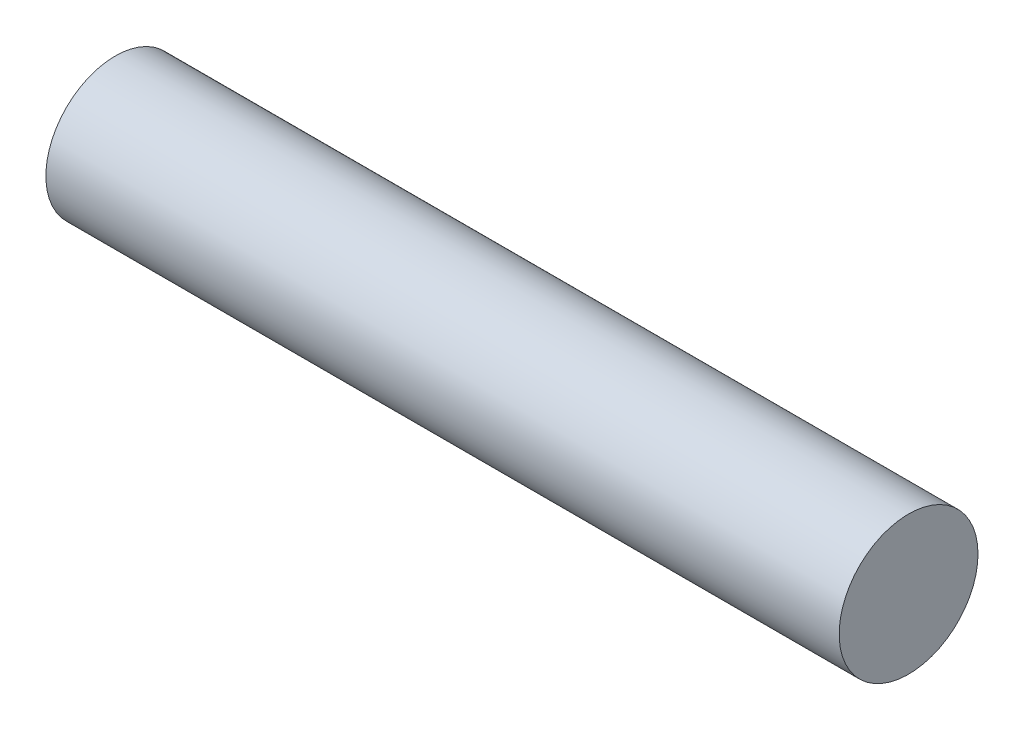
ISO-10303-21;
HEADER;
FILE_DESCRIPTION(('STEP AP214'),'2;1');
FILE_NAME('part.step','',(''),(''),'','','');
FILE_SCHEMA(('AUTOMOTIVE_DESIGN { 1 0 10303 214 1 1 1 1 }'));
ENDSEC;
DATA;
#1=APPLICATION_CONTEXT('core data for automotive mechanical design processes');
#2=APPLICATION_PROTOCOL_DEFINITION('international standard','automotive_design',2000,#1);
#3=PRODUCT_CONTEXT('',#1,'mechanical');
#4=PRODUCT('Part','Part','',(#3));
#5=PRODUCT_RELATED_PRODUCT_CATEGORY('part','',(#4));
#6=PRODUCT_DEFINITION_FORMATION('','',#4);
#7=PRODUCT_DEFINITION_CONTEXT('part definition',#1,'design');
#8=PRODUCT_DEFINITION('design','',#6,#7);
#9=PRODUCT_DEFINITION_SHAPE('','',#8);
#10=(LENGTH_UNIT() NAMED_UNIT(*) SI_UNIT(.MILLI.,.METRE.));
#11=(NAMED_UNIT(*) PLANE_ANGLE_UNIT() SI_UNIT($,.RADIAN.));
#12=(NAMED_UNIT(*) SI_UNIT($,.STERADIAN.) SOLID_ANGLE_UNIT());
#13=UNCERTAINTY_MEASURE_WITH_UNIT(LENGTH_MEASURE(1.E-05),#10,'distance_accuracy_value','');
#14=(GEOMETRIC_REPRESENTATION_CONTEXT(3) GLOBAL_UNCERTAINTY_ASSIGNED_CONTEXT((#13)) GLOBAL_UNIT_ASSIGNED_CONTEXT((#10,
#11,#12)) REPRESENTATION_CONTEXT('',''));
#15=CARTESIAN_POINT('',(0.,0.,0.));
#16=DIRECTION('',(0.,0.,1.));
#17=DIRECTION('',(1.,0.,0.));
#18=AXIS2_PLACEMENT_3D('',#15,#16,#17);
#19=CARTESIAN_POINT('',(20.,0.,0.));
#20=DIRECTION('',(-1.,0.,0.));
#21=DIRECTION('',(0.,0.,1.));
#22=AXIS2_PLACEMENT_3D('',#19,#20,#21);
#23=CYLINDRICAL_SURFACE('',#22,1.75);
#24=CARTESIAN_POINT('',(20.,0.,0.));
#25=DIRECTION('',(1.,0.,0.));
#26=DIRECTION('',(0.,0.,-1.));
#27=AXIS2_PLACEMENT_3D('',#24,#25,#26);
#28=CIRCLE('',#27,1.75);
#29=CARTESIAN_POINT('',(20.,0.,-1.75));
#30=VERTEX_POINT('',#29);
#31=EDGE_CURVE('E10',#30,#30,#28,.T.);
#32=ORIENTED_EDGE('',*,*,#31,.F.);
#33=EDGE_LOOP('',(#32));
#34=FACE_BOUND('',#33,.T.);
#35=CARTESIAN_POINT('',(0.,0.,0.));
#36=DIRECTION('',(1.,0.,0.));
#37=DIRECTION('',(0.,0.,-1.));
#38=AXIS2_PLACEMENT_3D('',#35,#36,#37);
#39=CIRCLE('',#38,1.75);
#40=CARTESIAN_POINT('',(0.,0.,-1.75));
#41=VERTEX_POINT('',#40);
#42=EDGE_CURVE('E36',#41,#41,#39,.T.);
#43=ORIENTED_EDGE('',*,*,#42,.T.);
#44=EDGE_LOOP('',(#43));
#45=FACE_BOUND('',#44,.T.);
#46=ADVANCED_FACE('F33',(#34,#45),#23,.T.);
#47=CARTESIAN_POINT('',(20.,0.,0.));
#48=DIRECTION('',(1.,0.,0.));
#49=DIRECTION('',(0.,0.,-1.));
#50=AXIS2_PLACEMENT_3D('',#47,#48,#49);
#51=PLANE('',#50);
#52=ORIENTED_EDGE('',*,*,#31,.T.);
#53=EDGE_LOOP('',(#52));
#54=FACE_BOUND('',#53,.T.);
#55=ADVANCED_FACE('F48',(#54),#51,.T.);
#56=CARTESIAN_POINT('',(0.,0.,0.));
#57=DIRECTION('',(1.,0.,0.));
#58=DIRECTION('',(0.,0.,-1.));
#59=AXIS2_PLACEMENT_3D('',#56,#57,#58);
#60=PLANE('',#59);
#61=ORIENTED_EDGE('',*,*,#42,.F.);
#62=EDGE_LOOP('',(#61));
#63=FACE_BOUND('',#62,.T.);
#64=ADVANCED_FACE('F46',(#63),#60,.F.);
#65=CLOSED_SHELL('',(#46,#55,#64));
#66=MANIFOLD_SOLID_BREP('B2',#65);
#67=ADVANCED_BREP_SHAPE_REPRESENTATION('',(#18,#66),#14);
#68=SHAPE_DEFINITION_REPRESENTATION(#9,#67);
ENDSEC;
END-ISO-10303-21;
